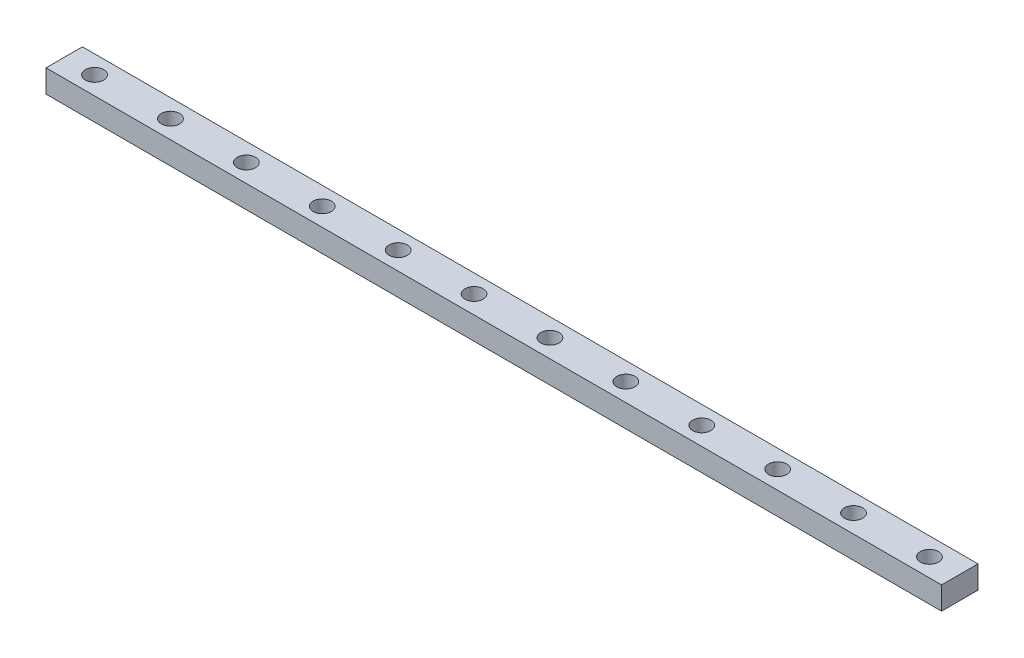
ISO-10303-21;
HEADER;
FILE_DESCRIPTION(('STEP AP214'),'2;1');
FILE_NAME('part.step','',(''),(''),'','','');
FILE_SCHEMA(('AUTOMOTIVE_DESIGN { 1 0 10303 214 1 1 1 1 }'));
ENDSEC;
DATA;
#1=APPLICATION_CONTEXT('core data for automotive mechanical design processes');
#2=APPLICATION_PROTOCOL_DEFINITION('international standard','automotive_design',2000,#1);
#3=PRODUCT_CONTEXT('',#1,'mechanical');
#4=PRODUCT('Part','Part','',(#3));
#5=PRODUCT_RELATED_PRODUCT_CATEGORY('part','',(#4));
#6=PRODUCT_DEFINITION_FORMATION('','',#4);
#7=PRODUCT_DEFINITION_CONTEXT('part definition',#1,'design');
#8=PRODUCT_DEFINITION('design','',#6,#7);
#9=PRODUCT_DEFINITION_SHAPE('','',#8);
#10=(LENGTH_UNIT() NAMED_UNIT(*) SI_UNIT(.MILLI.,.METRE.));
#11=(NAMED_UNIT(*) PLANE_ANGLE_UNIT() SI_UNIT($,.RADIAN.));
#12=(NAMED_UNIT(*) SI_UNIT($,.STERADIAN.) SOLID_ANGLE_UNIT());
#13=UNCERTAINTY_MEASURE_WITH_UNIT(LENGTH_MEASURE(1.E-05),#10,'distance_accuracy_value','');
#14=(GEOMETRIC_REPRESENTATION_CONTEXT(3) GLOBAL_UNCERTAINTY_ASSIGNED_CONTEXT((#13)) GLOBAL_UNIT_ASSIGNED_CONTEXT((#10,
#11,#12)) REPRESENTATION_CONTEXT('',''));
#15=CARTESIAN_POINT('',(0.,0.,0.));
#16=DIRECTION('',(0.,0.,1.));
#17=DIRECTION('',(1.,0.,0.));
#18=AXIS2_PLACEMENT_3D('',#15,#16,#17);
#19=CARTESIAN_POINT('',(0.,7.5,-6.));
#20=DIRECTION('',(1.,0.,0.));
#21=DIRECTION('',(0.,0.,-1.));
#22=AXIS2_PLACEMENT_3D('',#19,#20,#21);
#23=PLANE('',#22);
#24=DIRECTION('',(0.,0.,1.));
#25=VECTOR('',#24,1.);
#26=CARTESIAN_POINT('',(0.,0.,-6.));
#27=LINE('',#26,#25);
#28=CARTESIAN_POINT('',(0.,0.,-6.));
#29=VERTEX_POINT('',#28);
#30=CARTESIAN_POINT('',(0.,0.,6.));
#31=VERTEX_POINT('',#30);
#32=EDGE_CURVE('E97',#29,#31,#27,.T.);
#33=ORIENTED_EDGE('',*,*,#32,.T.);
#34=DIRECTION('',(0.,-1.,0.));
#35=VECTOR('',#34,1.);
#36=CARTESIAN_POINT('',(0.,7.5,6.));
#37=LINE('',#36,#35);
#38=CARTESIAN_POINT('',(0.,7.5,6.));
#39=VERTEX_POINT('',#38);
#40=EDGE_CURVE('E11',#39,#31,#37,.T.);
#41=ORIENTED_EDGE('',*,*,#40,.F.);
#42=DIRECTION('',(0.,0.,1.));
#43=VECTOR('',#42,1.);
#44=CARTESIAN_POINT('',(0.,7.5,-6.));
#45=LINE('',#44,#43);
#46=CARTESIAN_POINT('',(0.,7.5,-6.));
#47=VERTEX_POINT('',#46);
#48=EDGE_CURVE('E85',#47,#39,#45,.T.);
#49=ORIENTED_EDGE('',*,*,#48,.F.);
#50=DIRECTION('',(0.,-1.,0.));
#51=VECTOR('',#50,1.);
#52=CARTESIAN_POINT('',(0.,7.5,-6.));
#53=LINE('',#52,#51);
#54=EDGE_CURVE('E93',#47,#29,#53,.T.);
#55=ORIENTED_EDGE('',*,*,#54,.T.);
#56=EDGE_LOOP('',(#33,#41,#49,#55));
#57=FACE_BOUND('',#56,.T.);
#58=ADVANCED_FACE('F34',(#57),#23,.F.);
#59=CARTESIAN_POINT('',(0.,7.5,6.));
#60=DIRECTION('',(0.,0.,-1.));
#61=DIRECTION('',(-1.,0.,0.));
#62=AXIS2_PLACEMENT_3D('',#59,#60,#61);
#63=PLANE('',#62);
#64=DIRECTION('',(1.,0.,0.));
#65=VECTOR('',#64,1.);
#66=CARTESIAN_POINT('',(0.,0.,6.));
#67=LINE('',#66,#65);
#68=CARTESIAN_POINT('',(295.,0.,6.));
#69=VERTEX_POINT('',#68);
#70=EDGE_CURVE('E89',#31,#69,#67,.T.);
#71=ORIENTED_EDGE('',*,*,#70,.T.);
#72=DIRECTION('',(0.,-1.,0.));
#73=VECTOR('',#72,1.);
#74=CARTESIAN_POINT('',(295.,7.5,6.));
#75=LINE('',#74,#73);
#76=CARTESIAN_POINT('',(295.,7.5,6.));
#77=VERTEX_POINT('',#76);
#78=EDGE_CURVE('E42',#77,#69,#75,.T.);
#79=ORIENTED_EDGE('',*,*,#78,.F.);
#80=DIRECTION('',(1.,0.,0.));
#81=VECTOR('',#80,1.);
#82=CARTESIAN_POINT('',(0.,7.5,6.));
#83=LINE('',#82,#81);
#84=EDGE_CURVE('E80',#39,#77,#83,.T.);
#85=ORIENTED_EDGE('',*,*,#84,.F.);
#86=ORIENTED_EDGE('',*,*,#40,.T.);
#87=EDGE_LOOP('',(#71,#79,#85,#86));
#88=FACE_BOUND('',#87,.T.);
#89=ADVANCED_FACE('F88',(#88),#63,.F.);
#90=CARTESIAN_POINT('',(295.,7.5,-6.));
#91=DIRECTION('',(-1.,0.,0.));
#92=DIRECTION('',(0.,0.,1.));
#93=AXIS2_PLACEMENT_3D('',#90,#91,#92);
#94=PLANE('',#93);
#95=DIRECTION('',(0.,0.,-1.));
#96=VECTOR('',#95,1.);
#97=CARTESIAN_POINT('',(295.,0.,-6.));
#98=LINE('',#97,#96);
#99=CARTESIAN_POINT('',(295.,0.,-6.));
#100=VERTEX_POINT('',#99);
#101=EDGE_CURVE('E67',#69,#100,#98,.T.);
#102=ORIENTED_EDGE('',*,*,#101,.T.);
#103=DIRECTION('',(0.,-1.,0.));
#104=VECTOR('',#103,1.);
#105=CARTESIAN_POINT('',(295.,7.5,-6.));
#106=LINE('',#105,#104);
#107=CARTESIAN_POINT('',(295.,7.5,-6.));
#108=VERTEX_POINT('',#107);
#109=EDGE_CURVE('E90',#108,#100,#106,.T.);
#110=ORIENTED_EDGE('',*,*,#109,.F.);
#111=DIRECTION('',(0.,0.,-1.));
#112=VECTOR('',#111,1.);
#113=CARTESIAN_POINT('',(295.,7.5,-6.));
#114=LINE('',#113,#112);
#115=EDGE_CURVE('E83',#77,#108,#114,.T.);
#116=ORIENTED_EDGE('',*,*,#115,.F.);
#117=ORIENTED_EDGE('',*,*,#78,.T.);
#118=EDGE_LOOP('',(#102,#110,#116,#117));
#119=FACE_BOUND('',#118,.T.);
#120=ADVANCED_FACE('F91',(#119),#94,.F.);
#121=CARTESIAN_POINT('',(0.,7.5,-6.));
#122=DIRECTION('',(0.,0.,1.));
#123=DIRECTION('',(1.,0.,0.));
#124=AXIS2_PLACEMENT_3D('',#121,#122,#123);
#125=PLANE('',#124);
#126=DIRECTION('',(-1.,0.,0.));
#127=VECTOR('',#126,1.);
#128=CARTESIAN_POINT('',(0.,0.,-6.));
#129=LINE('',#128,#127);
#130=EDGE_CURVE('E73',#100,#29,#129,.T.);
#131=ORIENTED_EDGE('',*,*,#130,.T.);
#132=ORIENTED_EDGE('',*,*,#54,.F.);
#133=DIRECTION('',(-1.,0.,0.));
#134=VECTOR('',#133,1.);
#135=CARTESIAN_POINT('',(0.,7.5,-6.));
#136=LINE('',#135,#134);
#137=EDGE_CURVE('E50',#108,#47,#136,.T.);
#138=ORIENTED_EDGE('',*,*,#137,.F.);
#139=ORIENTED_EDGE('',*,*,#109,.T.);
#140=EDGE_LOOP('',(#131,#132,#138,#139));
#141=FACE_BOUND('',#140,.T.);
#142=ADVANCED_FACE('F105',(#141),#125,.F.);
#143=CARTESIAN_POINT('',(0.,7.5,6.));
#144=DIRECTION('',(0.,1.,0.));
#145=DIRECTION('',(0.,0.,1.));
#146=AXIS2_PLACEMENT_3D('',#143,#144,#145);
#147=PLANE('',#146);
#148=CARTESIAN_POINT('',(285.,7.5,0.));
#149=DIRECTION('',(0.,1.,0.));
#150=DIRECTION('',(0.,0.,1.));
#151=AXIS2_PLACEMENT_3D('',#148,#149,#150);
#152=CIRCLE('',#151,3.);
#153=CARTESIAN_POINT('',(285.,7.5,3.));
#154=VERTEX_POINT('',#153);
#155=EDGE_CURVE('E251',#154,#154,#152,.T.);
#156=ORIENTED_EDGE('',*,*,#155,.F.);
#157=EDGE_LOOP('',(#156));
#158=FACE_BOUND('',#157,.T.);
#159=CARTESIAN_POINT('',(260.,7.5,0.));
#160=DIRECTION('',(0.,1.,0.));
#161=DIRECTION('',(0.,0.,1.));
#162=AXIS2_PLACEMENT_3D('',#159,#160,#161);
#163=CIRCLE('',#162,3.);
#164=CARTESIAN_POINT('',(260.,7.5,3.));
#165=VERTEX_POINT('',#164);
#166=EDGE_CURVE('E239',#165,#165,#163,.T.);
#167=ORIENTED_EDGE('',*,*,#166,.F.);
#168=EDGE_LOOP('',(#167));
#169=FACE_BOUND('',#168,.T.);
#170=CARTESIAN_POINT('',(235.,7.5,0.));
#171=DIRECTION('',(0.,1.,0.));
#172=DIRECTION('',(0.,0.,1.));
#173=AXIS2_PLACEMENT_3D('',#170,#171,#172);
#174=CIRCLE('',#173,3.);
#175=CARTESIAN_POINT('',(235.,7.5,3.));
#176=VERTEX_POINT('',#175);
#177=EDGE_CURVE('E227',#176,#176,#174,.T.);
#178=ORIENTED_EDGE('',*,*,#177,.F.);
#179=EDGE_LOOP('',(#178));
#180=FACE_BOUND('',#179,.T.);
#181=CARTESIAN_POINT('',(210.,7.5,0.));
#182=DIRECTION('',(0.,1.,0.));
#183=DIRECTION('',(0.,0.,1.));
#184=AXIS2_PLACEMENT_3D('',#181,#182,#183);
#185=CIRCLE('',#184,3.);
#186=CARTESIAN_POINT('',(210.,7.5,3.));
#187=VERTEX_POINT('',#186);
#188=EDGE_CURVE('E215',#187,#187,#185,.T.);
#189=ORIENTED_EDGE('',*,*,#188,.F.);
#190=EDGE_LOOP('',(#189));
#191=FACE_BOUND('',#190,.T.);
#192=CARTESIAN_POINT('',(185.,7.5,0.));
#193=DIRECTION('',(0.,1.,0.));
#194=DIRECTION('',(0.,0.,1.));
#195=AXIS2_PLACEMENT_3D('',#192,#193,#194);
#196=CIRCLE('',#195,3.);
#197=CARTESIAN_POINT('',(185.,7.5,3.));
#198=VERTEX_POINT('',#197);
#199=EDGE_CURVE('E203',#198,#198,#196,.T.);
#200=ORIENTED_EDGE('',*,*,#199,.F.);
#201=EDGE_LOOP('',(#200));
#202=FACE_BOUND('',#201,.T.);
#203=CARTESIAN_POINT('',(160.,7.5,0.));
#204=DIRECTION('',(0.,1.,0.));
#205=DIRECTION('',(0.,0.,1.));
#206=AXIS2_PLACEMENT_3D('',#203,#204,#205);
#207=CIRCLE('',#206,3.);
#208=CARTESIAN_POINT('',(160.,7.5,3.));
#209=VERTEX_POINT('',#208);
#210=EDGE_CURVE('E191',#209,#209,#207,.T.);
#211=ORIENTED_EDGE('',*,*,#210,.F.);
#212=EDGE_LOOP('',(#211));
#213=FACE_BOUND('',#212,.T.);
#214=CARTESIAN_POINT('',(135.,7.5,0.));
#215=DIRECTION('',(0.,1.,0.));
#216=DIRECTION('',(0.,0.,1.));
#217=AXIS2_PLACEMENT_3D('',#214,#215,#216);
#218=CIRCLE('',#217,3.);
#219=CARTESIAN_POINT('',(135.,7.5,3.));
#220=VERTEX_POINT('',#219);
#221=EDGE_CURVE('E179',#220,#220,#218,.T.);
#222=ORIENTED_EDGE('',*,*,#221,.F.);
#223=EDGE_LOOP('',(#222));
#224=FACE_BOUND('',#223,.T.);
#225=CARTESIAN_POINT('',(110.,7.5,0.));
#226=DIRECTION('',(0.,1.,0.));
#227=DIRECTION('',(0.,0.,1.));
#228=AXIS2_PLACEMENT_3D('',#225,#226,#227);
#229=CIRCLE('',#228,3.);
#230=CARTESIAN_POINT('',(110.,7.5,3.));
#231=VERTEX_POINT('',#230);
#232=EDGE_CURVE('E167',#231,#231,#229,.T.);
#233=ORIENTED_EDGE('',*,*,#232,.F.);
#234=EDGE_LOOP('',(#233));
#235=FACE_BOUND('',#234,.T.);
#236=CARTESIAN_POINT('',(85.,7.5,0.));
#237=DIRECTION('',(0.,1.,0.));
#238=DIRECTION('',(0.,0.,1.));
#239=AXIS2_PLACEMENT_3D('',#236,#237,#238);
#240=CIRCLE('',#239,3.);
#241=CARTESIAN_POINT('',(85.,7.5,3.));
#242=VERTEX_POINT('',#241);
#243=EDGE_CURVE('E155',#242,#242,#240,.T.);
#244=ORIENTED_EDGE('',*,*,#243,.F.);
#245=EDGE_LOOP('',(#244));
#246=FACE_BOUND('',#245,.T.);
#247=CARTESIAN_POINT('',(60.,7.5,0.));
#248=DIRECTION('',(0.,1.,0.));
#249=DIRECTION('',(0.,0.,1.));
#250=AXIS2_PLACEMENT_3D('',#247,#248,#249);
#251=CIRCLE('',#250,3.);
#252=CARTESIAN_POINT('',(60.,7.5,3.));
#253=VERTEX_POINT('',#252);
#254=EDGE_CURVE('E143',#253,#253,#251,.T.);
#255=ORIENTED_EDGE('',*,*,#254,.F.);
#256=EDGE_LOOP('',(#255));
#257=FACE_BOUND('',#256,.T.);
#258=CARTESIAN_POINT('',(35.,7.5,0.));
#259=DIRECTION('',(0.,1.,0.));
#260=DIRECTION('',(0.,0.,1.));
#261=AXIS2_PLACEMENT_3D('',#258,#259,#260);
#262=CIRCLE('',#261,3.);
#263=CARTESIAN_POINT('',(35.,7.5,3.));
#264=VERTEX_POINT('',#263);
#265=EDGE_CURVE('E131',#264,#264,#262,.T.);
#266=ORIENTED_EDGE('',*,*,#265,.F.);
#267=EDGE_LOOP('',(#266));
#268=FACE_BOUND('',#267,.T.);
#269=CARTESIAN_POINT('',(10.,7.5,0.));
#270=DIRECTION('',(0.,1.,0.));
#271=DIRECTION('',(0.,0.,1.));
#272=AXIS2_PLACEMENT_3D('',#269,#270,#271);
#273=CIRCLE('',#272,3.);
#274=CARTESIAN_POINT('',(10.,7.5,3.));
#275=VERTEX_POINT('',#274);
#276=EDGE_CURVE('E119',#275,#275,#273,.T.);
#277=ORIENTED_EDGE('',*,*,#276,.F.);
#278=EDGE_LOOP('',(#277));
#279=FACE_BOUND('',#278,.T.);
#280=ORIENTED_EDGE('',*,*,#48,.T.);
#281=ORIENTED_EDGE('',*,*,#84,.T.);
#282=ORIENTED_EDGE('',*,*,#115,.T.);
#283=ORIENTED_EDGE('',*,*,#137,.T.);
#284=EDGE_LOOP('',(#280,#281,#282,#283));
#285=FACE_BOUND('',#284,.T.);
#286=ADVANCED_FACE('F81',(#158,#169,#180,#191,#202,#213,#224,#235,#246,#257,#268,#279,#285),
#147,.T.);
#287=CARTESIAN_POINT('',(0.,0.,6.));
#288=DIRECTION('',(0.,1.,0.));
#289=DIRECTION('',(0.,0.,1.));
#290=AXIS2_PLACEMENT_3D('',#287,#288,#289);
#291=PLANE('',#290);
#292=CARTESIAN_POINT('',(285.,0.,0.));
#293=DIRECTION('',(0.,1.,0.));
#294=DIRECTION('',(0.,0.,1.));
#295=AXIS2_PLACEMENT_3D('',#292,#293,#294);
#296=CIRCLE('',#295,1.74999999999997);
#297=CARTESIAN_POINT('',(285.,0.,1.74999999999997));
#298=VERTEX_POINT('',#297);
#299=EDGE_CURVE('E242',#298,#298,#296,.T.);
#300=ORIENTED_EDGE('',*,*,#299,.T.);
#301=EDGE_LOOP('',(#300));
#302=FACE_BOUND('',#301,.T.);
#303=CARTESIAN_POINT('',(260.,0.,0.));
#304=DIRECTION('',(0.,1.,0.));
#305=DIRECTION('',(0.,0.,1.));
#306=AXIS2_PLACEMENT_3D('',#303,#304,#305);
#307=CIRCLE('',#306,1.74999999999997);
#308=CARTESIAN_POINT('',(260.,0.,1.74999999999997));
#309=VERTEX_POINT('',#308);
#310=EDGE_CURVE('E230',#309,#309,#307,.T.);
#311=ORIENTED_EDGE('',*,*,#310,.T.);
#312=EDGE_LOOP('',(#311));
#313=FACE_BOUND('',#312,.T.);
#314=CARTESIAN_POINT('',(235.,0.,0.));
#315=DIRECTION('',(0.,1.,0.));
#316=DIRECTION('',(0.,0.,1.));
#317=AXIS2_PLACEMENT_3D('',#314,#315,#316);
#318=CIRCLE('',#317,1.75);
#319=CARTESIAN_POINT('',(235.,0.,1.75));
#320=VERTEX_POINT('',#319);
#321=EDGE_CURVE('E218',#320,#320,#318,.T.);
#322=ORIENTED_EDGE('',*,*,#321,.T.);
#323=EDGE_LOOP('',(#322));
#324=FACE_BOUND('',#323,.T.);
#325=CARTESIAN_POINT('',(210.,0.,0.));
#326=DIRECTION('',(0.,1.,0.));
#327=DIRECTION('',(0.,0.,1.));
#328=AXIS2_PLACEMENT_3D('',#325,#326,#327);
#329=CIRCLE('',#328,1.75);
#330=CARTESIAN_POINT('',(210.,0.,1.75));
#331=VERTEX_POINT('',#330);
#332=EDGE_CURVE('E206',#331,#331,#329,.T.);
#333=ORIENTED_EDGE('',*,*,#332,.T.);
#334=EDGE_LOOP('',(#333));
#335=FACE_BOUND('',#334,.T.);
#336=CARTESIAN_POINT('',(185.,0.,0.));
#337=DIRECTION('',(0.,1.,0.));
#338=DIRECTION('',(0.,0.,1.));
#339=AXIS2_PLACEMENT_3D('',#336,#337,#338);
#340=CIRCLE('',#339,1.75);
#341=CARTESIAN_POINT('',(185.,0.,1.75));
#342=VERTEX_POINT('',#341);
#343=EDGE_CURVE('E194',#342,#342,#340,.T.);
#344=ORIENTED_EDGE('',*,*,#343,.T.);
#345=EDGE_LOOP('',(#344));
#346=FACE_BOUND('',#345,.T.);
#347=CARTESIAN_POINT('',(160.,0.,0.));
#348=DIRECTION('',(0.,1.,0.));
#349=DIRECTION('',(0.,0.,1.));
#350=AXIS2_PLACEMENT_3D('',#347,#348,#349);
#351=CIRCLE('',#350,1.75);
#352=CARTESIAN_POINT('',(160.,0.,1.75));
#353=VERTEX_POINT('',#352);
#354=EDGE_CURVE('E182',#353,#353,#351,.T.);
#355=ORIENTED_EDGE('',*,*,#354,.T.);
#356=EDGE_LOOP('',(#355));
#357=FACE_BOUND('',#356,.T.);
#358=CARTESIAN_POINT('',(135.,0.,0.));
#359=DIRECTION('',(0.,1.,0.));
#360=DIRECTION('',(0.,0.,1.));
#361=AXIS2_PLACEMENT_3D('',#358,#359,#360);
#362=CIRCLE('',#361,1.75);
#363=CARTESIAN_POINT('',(135.,0.,1.75));
#364=VERTEX_POINT('',#363);
#365=EDGE_CURVE('E170',#364,#364,#362,.T.);
#366=ORIENTED_EDGE('',*,*,#365,.T.);
#367=EDGE_LOOP('',(#366));
#368=FACE_BOUND('',#367,.T.);
#369=CARTESIAN_POINT('',(110.,0.,0.));
#370=DIRECTION('',(0.,1.,0.));
#371=DIRECTION('',(0.,0.,1.));
#372=AXIS2_PLACEMENT_3D('',#369,#370,#371);
#373=CIRCLE('',#372,1.75);
#374=CARTESIAN_POINT('',(110.,0.,1.75));
#375=VERTEX_POINT('',#374);
#376=EDGE_CURVE('E158',#375,#375,#373,.T.);
#377=ORIENTED_EDGE('',*,*,#376,.T.);
#378=EDGE_LOOP('',(#377));
#379=FACE_BOUND('',#378,.T.);
#380=CARTESIAN_POINT('',(85.,0.,0.));
#381=DIRECTION('',(0.,1.,0.));
#382=DIRECTION('',(0.,0.,1.));
#383=AXIS2_PLACEMENT_3D('',#380,#381,#382);
#384=CIRCLE('',#383,1.75);
#385=CARTESIAN_POINT('',(85.,0.,1.75));
#386=VERTEX_POINT('',#385);
#387=EDGE_CURVE('E146',#386,#386,#384,.T.);
#388=ORIENTED_EDGE('',*,*,#387,.T.);
#389=EDGE_LOOP('',(#388));
#390=FACE_BOUND('',#389,.T.);
#391=CARTESIAN_POINT('',(60.,0.,0.));
#392=DIRECTION('',(0.,1.,0.));
#393=DIRECTION('',(0.,0.,1.));
#394=AXIS2_PLACEMENT_3D('',#391,#392,#393);
#395=CIRCLE('',#394,1.75);
#396=CARTESIAN_POINT('',(60.,0.,1.75));
#397=VERTEX_POINT('',#396);
#398=EDGE_CURVE('E134',#397,#397,#395,.T.);
#399=ORIENTED_EDGE('',*,*,#398,.T.);
#400=EDGE_LOOP('',(#399));
#401=FACE_BOUND('',#400,.T.);
#402=CARTESIAN_POINT('',(35.,0.,0.));
#403=DIRECTION('',(0.,1.,0.));
#404=DIRECTION('',(0.,0.,1.));
#405=AXIS2_PLACEMENT_3D('',#402,#403,#404);
#406=CIRCLE('',#405,1.75);
#407=CARTESIAN_POINT('',(35.,0.,1.75));
#408=VERTEX_POINT('',#407);
#409=EDGE_CURVE('E122',#408,#408,#406,.T.);
#410=ORIENTED_EDGE('',*,*,#409,.T.);
#411=EDGE_LOOP('',(#410));
#412=FACE_BOUND('',#411,.T.);
#413=CARTESIAN_POINT('',(10.,0.,0.));
#414=DIRECTION('',(0.,1.,0.));
#415=DIRECTION('',(0.,0.,1.));
#416=AXIS2_PLACEMENT_3D('',#413,#414,#415);
#417=CIRCLE('',#416,1.75);
#418=CARTESIAN_POINT('',(10.,0.,1.75));
#419=VERTEX_POINT('',#418);
#420=EDGE_CURVE('E100',#419,#419,#417,.T.);
#421=ORIENTED_EDGE('',*,*,#420,.T.);
#422=EDGE_LOOP('',(#421));
#423=FACE_BOUND('',#422,.T.);
#424=ORIENTED_EDGE('',*,*,#32,.F.);
#425=ORIENTED_EDGE('',*,*,#130,.F.);
#426=ORIENTED_EDGE('',*,*,#101,.F.);
#427=ORIENTED_EDGE('',*,*,#70,.F.);
#428=EDGE_LOOP('',(#424,#425,#426,#427));
#429=FACE_BOUND('',#428,.T.);
#430=ADVANCED_FACE('F108',(#302,#313,#324,#335,#346,#357,#368,#379,#390,#401,#412,#423,#429),
#291,.F.);
#431=CARTESIAN_POINT('',(10.,7.5,0.));
#432=DIRECTION('',(0.,1.,0.));
#433=DIRECTION('',(0.,0.,1.));
#434=AXIS2_PLACEMENT_3D('',#431,#432,#433);
#435=CYLINDRICAL_SURFACE('',#434,1.75);
#436=ORIENTED_EDGE('',*,*,#420,.F.);
#437=EDGE_LOOP('',(#436));
#438=FACE_BOUND('',#437,.T.);
#439=CARTESIAN_POINT('',(10.,3.,0.));
#440=DIRECTION('',(0.,1.,0.));
#441=DIRECTION('',(0.,0.,1.));
#442=AXIS2_PLACEMENT_3D('',#439,#440,#441);
#443=CIRCLE('',#442,1.75);
#444=CARTESIAN_POINT('',(10.,3.,1.75));
#445=VERTEX_POINT('',#444);
#446=EDGE_CURVE('E113',#445,#445,#443,.T.);
#447=ORIENTED_EDGE('',*,*,#446,.T.);
#448=EDGE_LOOP('',(#447));
#449=FACE_BOUND('',#448,.T.);
#450=ADVANCED_FACE('F295',(#438,#449),#435,.F.);
#451=CARTESIAN_POINT('',(11.75,3.,0.));
#452=DIRECTION('',(0.,-1.,0.));
#453=DIRECTION('',(0.,0.,-1.));
#454=AXIS2_PLACEMENT_3D('',#451,#452,#453);
#455=PLANE('',#454);
#456=ORIENTED_EDGE('',*,*,#446,.F.);
#457=EDGE_LOOP('',(#456));
#458=FACE_BOUND('',#457,.T.);
#459=CARTESIAN_POINT('',(10.,3.,0.));
#460=DIRECTION('',(0.,1.,0.));
#461=DIRECTION('',(0.,0.,1.));
#462=AXIS2_PLACEMENT_3D('',#459,#460,#461);
#463=CIRCLE('',#462,3.);
#464=CARTESIAN_POINT('',(10.,3.,3.));
#465=VERTEX_POINT('',#464);
#466=EDGE_CURVE('E116',#465,#465,#463,.T.);
#467=ORIENTED_EDGE('',*,*,#466,.T.);
#468=EDGE_LOOP('',(#467));
#469=FACE_BOUND('',#468,.T.);
#470=ADVANCED_FACE('F285',(#458,#469),#455,.F.);
#471=CARTESIAN_POINT('',(10.,7.5,0.));
#472=DIRECTION('',(0.,1.,0.));
#473=DIRECTION('',(0.,0.,1.));
#474=AXIS2_PLACEMENT_3D('',#471,#472,#473);
#475=CYLINDRICAL_SURFACE('',#474,3.);
#476=ORIENTED_EDGE('',*,*,#466,.F.);
#477=EDGE_LOOP('',(#476));
#478=FACE_BOUND('',#477,.T.);
#479=ORIENTED_EDGE('',*,*,#276,.T.);
#480=EDGE_LOOP('',(#479));
#481=FACE_BOUND('',#480,.T.);
#482=ADVANCED_FACE('F282',(#478,#481),#475,.F.);
#483=CARTESIAN_POINT('',(35.,7.5,0.));
#484=DIRECTION('',(0.,1.,0.));
#485=DIRECTION('',(0.,0.,1.));
#486=AXIS2_PLACEMENT_3D('',#483,#484,#485);
#487=CYLINDRICAL_SURFACE('',#486,1.75);
#488=ORIENTED_EDGE('',*,*,#409,.F.);
#489=EDGE_LOOP('',(#488));
#490=FACE_BOUND('',#489,.T.);
#491=CARTESIAN_POINT('',(35.,3.,0.));
#492=DIRECTION('',(0.,1.,0.));
#493=DIRECTION('',(0.,0.,1.));
#494=AXIS2_PLACEMENT_3D('',#491,#492,#493);
#495=CIRCLE('',#494,1.75);
#496=CARTESIAN_POINT('',(35.,3.,1.75));
#497=VERTEX_POINT('',#496);
#498=EDGE_CURVE('E125',#497,#497,#495,.T.);
#499=ORIENTED_EDGE('',*,*,#498,.T.);
#500=EDGE_LOOP('',(#499));
#501=FACE_BOUND('',#500,.T.);
#502=ADVANCED_FACE('F284',(#490,#501),#487,.F.);
#503=CARTESIAN_POINT('',(36.75,3.,0.));
#504=DIRECTION('',(0.,-1.,0.));
#505=DIRECTION('',(0.,0.,-1.));
#506=AXIS2_PLACEMENT_3D('',#503,#504,#505);
#507=PLANE('',#506);
#508=ORIENTED_EDGE('',*,*,#498,.F.);
#509=EDGE_LOOP('',(#508));
#510=FACE_BOUND('',#509,.T.);
#511=CARTESIAN_POINT('',(35.,3.,0.));
#512=DIRECTION('',(0.,1.,0.));
#513=DIRECTION('',(0.,0.,1.));
#514=AXIS2_PLACEMENT_3D('',#511,#512,#513);
#515=CIRCLE('',#514,3.);
#516=CARTESIAN_POINT('',(35.,3.,3.));
#517=VERTEX_POINT('',#516);
#518=EDGE_CURVE('E128',#517,#517,#515,.T.);
#519=ORIENTED_EDGE('',*,*,#518,.T.);
#520=EDGE_LOOP('',(#519));
#521=FACE_BOUND('',#520,.T.);
#522=ADVANCED_FACE('F292',(#510,#521),#507,.F.);
#523=CARTESIAN_POINT('',(35.,7.5,0.));
#524=DIRECTION('',(0.,1.,0.));
#525=DIRECTION('',(0.,0.,1.));
#526=AXIS2_PLACEMENT_3D('',#523,#524,#525);
#527=CYLINDRICAL_SURFACE('',#526,3.);
#528=ORIENTED_EDGE('',*,*,#518,.F.);
#529=EDGE_LOOP('',(#528));
#530=FACE_BOUND('',#529,.T.);
#531=ORIENTED_EDGE('',*,*,#265,.T.);
#532=EDGE_LOOP('',(#531));
#533=FACE_BOUND('',#532,.T.);
#534=ADVANCED_FACE('F359',(#530,#533),#527,.F.);
#535=CARTESIAN_POINT('',(60.,7.5,0.));
#536=DIRECTION('',(0.,1.,0.));
#537=DIRECTION('',(0.,0.,1.));
#538=AXIS2_PLACEMENT_3D('',#535,#536,#537);
#539=CYLINDRICAL_SURFACE('',#538,1.75);
#540=ORIENTED_EDGE('',*,*,#398,.F.);
#541=EDGE_LOOP('',(#540));
#542=FACE_BOUND('',#541,.T.);
#543=CARTESIAN_POINT('',(60.,3.,0.));
#544=DIRECTION('',(0.,1.,0.));
#545=DIRECTION('',(0.,0.,1.));
#546=AXIS2_PLACEMENT_3D('',#543,#544,#545);
#547=CIRCLE('',#546,1.75);
#548=CARTESIAN_POINT('',(60.,3.,1.75));
#549=VERTEX_POINT('',#548);
#550=EDGE_CURVE('E137',#549,#549,#547,.T.);
#551=ORIENTED_EDGE('',*,*,#550,.T.);
#552=EDGE_LOOP('',(#551));
#553=FACE_BOUND('',#552,.T.);
#554=ADVANCED_FACE('F369',(#542,#553),#539,.F.);
#555=CARTESIAN_POINT('',(61.75,3.,0.));
#556=DIRECTION('',(0.,-1.,0.));
#557=DIRECTION('',(0.,0.,-1.));
#558=AXIS2_PLACEMENT_3D('',#555,#556,#557);
#559=PLANE('',#558);
#560=ORIENTED_EDGE('',*,*,#550,.F.);
#561=EDGE_LOOP('',(#560));
#562=FACE_BOUND('',#561,.T.);
#563=CARTESIAN_POINT('',(60.,3.,0.));
#564=DIRECTION('',(0.,1.,0.));
#565=DIRECTION('',(0.,0.,1.));
#566=AXIS2_PLACEMENT_3D('',#563,#564,#565);
#567=CIRCLE('',#566,3.);
#568=CARTESIAN_POINT('',(60.,3.,3.));
#569=VERTEX_POINT('',#568);
#570=EDGE_CURVE('E140',#569,#569,#567,.T.);
#571=ORIENTED_EDGE('',*,*,#570,.T.);
#572=EDGE_LOOP('',(#571));
#573=FACE_BOUND('',#572,.T.);
#574=ADVANCED_FACE('F379',(#562,#573),#559,.F.);
#575=CARTESIAN_POINT('',(60.,7.5,0.));
#576=DIRECTION('',(0.,1.,0.));
#577=DIRECTION('',(0.,0.,1.));
#578=AXIS2_PLACEMENT_3D('',#575,#576,#577);
#579=CYLINDRICAL_SURFACE('',#578,3.);
#580=ORIENTED_EDGE('',*,*,#570,.F.);
#581=EDGE_LOOP('',(#580));
#582=FACE_BOUND('',#581,.T.);
#583=ORIENTED_EDGE('',*,*,#254,.T.);
#584=EDGE_LOOP('',(#583));
#585=FACE_BOUND('',#584,.T.);
#586=ADVANCED_FACE('F389',(#582,#585),#579,.F.);
#587=CARTESIAN_POINT('',(85.,7.5,0.));
#588=DIRECTION('',(0.,1.,0.));
#589=DIRECTION('',(0.,0.,1.));
#590=AXIS2_PLACEMENT_3D('',#587,#588,#589);
#591=CYLINDRICAL_SURFACE('',#590,1.75);
#592=ORIENTED_EDGE('',*,*,#387,.F.);
#593=EDGE_LOOP('',(#592));
#594=FACE_BOUND('',#593,.T.);
#595=CARTESIAN_POINT('',(85.,3.,0.));
#596=DIRECTION('',(0.,1.,0.));
#597=DIRECTION('',(0.,0.,1.));
#598=AXIS2_PLACEMENT_3D('',#595,#596,#597);
#599=CIRCLE('',#598,1.75);
#600=CARTESIAN_POINT('',(85.,3.,1.75));
#601=VERTEX_POINT('',#600);
#602=EDGE_CURVE('E149',#601,#601,#599,.T.);
#603=ORIENTED_EDGE('',*,*,#602,.T.);
#604=EDGE_LOOP('',(#603));
#605=FACE_BOUND('',#604,.T.);
#606=ADVANCED_FACE('F399',(#594,#605),#591,.F.);
#607=CARTESIAN_POINT('',(86.75,3.,0.));
#608=DIRECTION('',(0.,-1.,0.));
#609=DIRECTION('',(0.,0.,-1.));
#610=AXIS2_PLACEMENT_3D('',#607,#608,#609);
#611=PLANE('',#610);
#612=ORIENTED_EDGE('',*,*,#602,.F.);
#613=EDGE_LOOP('',(#612));
#614=FACE_BOUND('',#613,.T.);
#615=CARTESIAN_POINT('',(85.,3.,0.));
#616=DIRECTION('',(0.,1.,0.));
#617=DIRECTION('',(0.,0.,1.));
#618=AXIS2_PLACEMENT_3D('',#615,#616,#617);
#619=CIRCLE('',#618,3.);
#620=CARTESIAN_POINT('',(85.,3.,3.));
#621=VERTEX_POINT('',#620);
#622=EDGE_CURVE('E152',#621,#621,#619,.T.);
#623=ORIENTED_EDGE('',*,*,#622,.T.);
#624=EDGE_LOOP('',(#623));
#625=FACE_BOUND('',#624,.T.);
#626=ADVANCED_FACE('F409',(#614,#625),#611,.F.);
#627=CARTESIAN_POINT('',(85.,7.5,0.));
#628=DIRECTION('',(0.,1.,0.));
#629=DIRECTION('',(0.,0.,1.));
#630=AXIS2_PLACEMENT_3D('',#627,#628,#629);
#631=CYLINDRICAL_SURFACE('',#630,3.);
#632=ORIENTED_EDGE('',*,*,#622,.F.);
#633=EDGE_LOOP('',(#632));
#634=FACE_BOUND('',#633,.T.);
#635=ORIENTED_EDGE('',*,*,#243,.T.);
#636=EDGE_LOOP('',(#635));
#637=FACE_BOUND('',#636,.T.);
#638=ADVANCED_FACE('F419',(#634,#637),#631,.F.);
#639=CARTESIAN_POINT('',(110.,7.5,0.));
#640=DIRECTION('',(0.,1.,0.));
#641=DIRECTION('',(0.,0.,1.));
#642=AXIS2_PLACEMENT_3D('',#639,#640,#641);
#643=CYLINDRICAL_SURFACE('',#642,1.75);
#644=ORIENTED_EDGE('',*,*,#376,.F.);
#645=EDGE_LOOP('',(#644));
#646=FACE_BOUND('',#645,.T.);
#647=CARTESIAN_POINT('',(110.,3.,0.));
#648=DIRECTION('',(0.,1.,0.));
#649=DIRECTION('',(0.,0.,1.));
#650=AXIS2_PLACEMENT_3D('',#647,#648,#649);
#651=CIRCLE('',#650,1.75);
#652=CARTESIAN_POINT('',(110.,3.,1.75));
#653=VERTEX_POINT('',#652);
#654=EDGE_CURVE('E161',#653,#653,#651,.T.);
#655=ORIENTED_EDGE('',*,*,#654,.T.);
#656=EDGE_LOOP('',(#655));
#657=FACE_BOUND('',#656,.T.);
#658=ADVANCED_FACE('F429',(#646,#657),#643,.F.);
#659=CARTESIAN_POINT('',(111.75,3.,0.));
#660=DIRECTION('',(0.,-1.,0.));
#661=DIRECTION('',(0.,0.,-1.));
#662=AXIS2_PLACEMENT_3D('',#659,#660,#661);
#663=PLANE('',#662);
#664=ORIENTED_EDGE('',*,*,#654,.F.);
#665=EDGE_LOOP('',(#664));
#666=FACE_BOUND('',#665,.T.);
#667=CARTESIAN_POINT('',(110.,3.,0.));
#668=DIRECTION('',(0.,1.,0.));
#669=DIRECTION('',(0.,0.,1.));
#670=AXIS2_PLACEMENT_3D('',#667,#668,#669);
#671=CIRCLE('',#670,3.);
#672=CARTESIAN_POINT('',(110.,3.,3.));
#673=VERTEX_POINT('',#672);
#674=EDGE_CURVE('E164',#673,#673,#671,.T.);
#675=ORIENTED_EDGE('',*,*,#674,.T.);
#676=EDGE_LOOP('',(#675));
#677=FACE_BOUND('',#676,.T.);
#678=ADVANCED_FACE('F439',(#666,#677),#663,.F.);
#679=CARTESIAN_POINT('',(110.,7.5,0.));
#680=DIRECTION('',(0.,1.,0.));
#681=DIRECTION('',(0.,0.,1.));
#682=AXIS2_PLACEMENT_3D('',#679,#680,#681);
#683=CYLINDRICAL_SURFACE('',#682,3.);
#684=ORIENTED_EDGE('',*,*,#674,.F.);
#685=EDGE_LOOP('',(#684));
#686=FACE_BOUND('',#685,.T.);
#687=ORIENTED_EDGE('',*,*,#232,.T.);
#688=EDGE_LOOP('',(#687));
#689=FACE_BOUND('',#688,.T.);
#690=ADVANCED_FACE('F449',(#686,#689),#683,.F.);
#691=CARTESIAN_POINT('',(135.,7.5,0.));
#692=DIRECTION('',(0.,1.,0.));
#693=DIRECTION('',(0.,0.,1.));
#694=AXIS2_PLACEMENT_3D('',#691,#692,#693);
#695=CYLINDRICAL_SURFACE('',#694,1.75);
#696=ORIENTED_EDGE('',*,*,#365,.F.);
#697=EDGE_LOOP('',(#696));
#698=FACE_BOUND('',#697,.T.);
#699=CARTESIAN_POINT('',(135.,3.,0.));
#700=DIRECTION('',(0.,1.,0.));
#701=DIRECTION('',(0.,0.,1.));
#702=AXIS2_PLACEMENT_3D('',#699,#700,#701);
#703=CIRCLE('',#702,1.75);
#704=CARTESIAN_POINT('',(135.,3.,1.75));
#705=VERTEX_POINT('',#704);
#706=EDGE_CURVE('E173',#705,#705,#703,.T.);
#707=ORIENTED_EDGE('',*,*,#706,.T.);
#708=EDGE_LOOP('',(#707));
#709=FACE_BOUND('',#708,.T.);
#710=ADVANCED_FACE('F459',(#698,#709),#695,.F.);
#711=CARTESIAN_POINT('',(136.75,3.,0.));
#712=DIRECTION('',(0.,-1.,0.));
#713=DIRECTION('',(0.,0.,-1.));
#714=AXIS2_PLACEMENT_3D('',#711,#712,#713);
#715=PLANE('',#714);
#716=ORIENTED_EDGE('',*,*,#706,.F.);
#717=EDGE_LOOP('',(#716));
#718=FACE_BOUND('',#717,.T.);
#719=CARTESIAN_POINT('',(135.,3.,0.));
#720=DIRECTION('',(0.,1.,0.));
#721=DIRECTION('',(0.,0.,1.));
#722=AXIS2_PLACEMENT_3D('',#719,#720,#721);
#723=CIRCLE('',#722,3.);
#724=CARTESIAN_POINT('',(135.,3.,3.));
#725=VERTEX_POINT('',#724);
#726=EDGE_CURVE('E176',#725,#725,#723,.T.);
#727=ORIENTED_EDGE('',*,*,#726,.T.);
#728=EDGE_LOOP('',(#727));
#729=FACE_BOUND('',#728,.T.);
#730=ADVANCED_FACE('F469',(#718,#729),#715,.F.);
#731=CARTESIAN_POINT('',(135.,7.5,0.));
#732=DIRECTION('',(0.,1.,0.));
#733=DIRECTION('',(0.,0.,1.));
#734=AXIS2_PLACEMENT_3D('',#731,#732,#733);
#735=CYLINDRICAL_SURFACE('',#734,3.);
#736=ORIENTED_EDGE('',*,*,#726,.F.);
#737=EDGE_LOOP('',(#736));
#738=FACE_BOUND('',#737,.T.);
#739=ORIENTED_EDGE('',*,*,#221,.T.);
#740=EDGE_LOOP('',(#739));
#741=FACE_BOUND('',#740,.T.);
#742=ADVANCED_FACE('F479',(#738,#741),#735,.F.);
#743=CARTESIAN_POINT('',(160.,7.5,0.));
#744=DIRECTION('',(0.,1.,0.));
#745=DIRECTION('',(0.,0.,1.));
#746=AXIS2_PLACEMENT_3D('',#743,#744,#745);
#747=CYLINDRICAL_SURFACE('',#746,1.75);
#748=ORIENTED_EDGE('',*,*,#354,.F.);
#749=EDGE_LOOP('',(#748));
#750=FACE_BOUND('',#749,.T.);
#751=CARTESIAN_POINT('',(160.,3.,0.));
#752=DIRECTION('',(0.,1.,0.));
#753=DIRECTION('',(0.,0.,1.));
#754=AXIS2_PLACEMENT_3D('',#751,#752,#753);
#755=CIRCLE('',#754,1.75);
#756=CARTESIAN_POINT('',(160.,3.,1.75));
#757=VERTEX_POINT('',#756);
#758=EDGE_CURVE('E185',#757,#757,#755,.T.);
#759=ORIENTED_EDGE('',*,*,#758,.T.);
#760=EDGE_LOOP('',(#759));
#761=FACE_BOUND('',#760,.T.);
#762=ADVANCED_FACE('F489',(#750,#761),#747,.F.);
#763=CARTESIAN_POINT('',(161.75,3.,0.));
#764=DIRECTION('',(0.,-1.,0.));
#765=DIRECTION('',(0.,0.,-1.));
#766=AXIS2_PLACEMENT_3D('',#763,#764,#765);
#767=PLANE('',#766);
#768=ORIENTED_EDGE('',*,*,#758,.F.);
#769=EDGE_LOOP('',(#768));
#770=FACE_BOUND('',#769,.T.);
#771=CARTESIAN_POINT('',(160.,3.,0.));
#772=DIRECTION('',(0.,1.,0.));
#773=DIRECTION('',(0.,0.,1.));
#774=AXIS2_PLACEMENT_3D('',#771,#772,#773);
#775=CIRCLE('',#774,3.);
#776=CARTESIAN_POINT('',(160.,3.,3.));
#777=VERTEX_POINT('',#776);
#778=EDGE_CURVE('E188',#777,#777,#775,.T.);
#779=ORIENTED_EDGE('',*,*,#778,.T.);
#780=EDGE_LOOP('',(#779));
#781=FACE_BOUND('',#780,.T.);
#782=ADVANCED_FACE('F499',(#770,#781),#767,.F.);
#783=CARTESIAN_POINT('',(160.,7.5,0.));
#784=DIRECTION('',(0.,1.,0.));
#785=DIRECTION('',(0.,0.,1.));
#786=AXIS2_PLACEMENT_3D('',#783,#784,#785);
#787=CYLINDRICAL_SURFACE('',#786,3.);
#788=ORIENTED_EDGE('',*,*,#778,.F.);
#789=EDGE_LOOP('',(#788));
#790=FACE_BOUND('',#789,.T.);
#791=ORIENTED_EDGE('',*,*,#210,.T.);
#792=EDGE_LOOP('',(#791));
#793=FACE_BOUND('',#792,.T.);
#794=ADVANCED_FACE('F509',(#790,#793),#787,.F.);
#795=CARTESIAN_POINT('',(185.,7.5,0.));
#796=DIRECTION('',(0.,1.,0.));
#797=DIRECTION('',(0.,0.,1.));
#798=AXIS2_PLACEMENT_3D('',#795,#796,#797);
#799=CYLINDRICAL_SURFACE('',#798,1.75);
#800=ORIENTED_EDGE('',*,*,#343,.F.);
#801=EDGE_LOOP('',(#800));
#802=FACE_BOUND('',#801,.T.);
#803=CARTESIAN_POINT('',(185.,3.,0.));
#804=DIRECTION('',(0.,1.,0.));
#805=DIRECTION('',(0.,0.,1.));
#806=AXIS2_PLACEMENT_3D('',#803,#804,#805);
#807=CIRCLE('',#806,1.75);
#808=CARTESIAN_POINT('',(185.,3.,1.75));
#809=VERTEX_POINT('',#808);
#810=EDGE_CURVE('E197',#809,#809,#807,.T.);
#811=ORIENTED_EDGE('',*,*,#810,.T.);
#812=EDGE_LOOP('',(#811));
#813=FACE_BOUND('',#812,.T.);
#814=ADVANCED_FACE('F519',(#802,#813),#799,.F.);
#815=CARTESIAN_POINT('',(186.75,3.,0.));
#816=DIRECTION('',(0.,-1.,0.));
#817=DIRECTION('',(0.,0.,-1.));
#818=AXIS2_PLACEMENT_3D('',#815,#816,#817);
#819=PLANE('',#818);
#820=ORIENTED_EDGE('',*,*,#810,.F.);
#821=EDGE_LOOP('',(#820));
#822=FACE_BOUND('',#821,.T.);
#823=CARTESIAN_POINT('',(185.,3.,0.));
#824=DIRECTION('',(0.,1.,0.));
#825=DIRECTION('',(0.,0.,1.));
#826=AXIS2_PLACEMENT_3D('',#823,#824,#825);
#827=CIRCLE('',#826,3.);
#828=CARTESIAN_POINT('',(185.,3.,3.));
#829=VERTEX_POINT('',#828);
#830=EDGE_CURVE('E200',#829,#829,#827,.T.);
#831=ORIENTED_EDGE('',*,*,#830,.T.);
#832=EDGE_LOOP('',(#831));
#833=FACE_BOUND('',#832,.T.);
#834=ADVANCED_FACE('F529',(#822,#833),#819,.F.);
#835=CARTESIAN_POINT('',(185.,7.5,0.));
#836=DIRECTION('',(0.,1.,0.));
#837=DIRECTION('',(0.,0.,1.));
#838=AXIS2_PLACEMENT_3D('',#835,#836,#837);
#839=CYLINDRICAL_SURFACE('',#838,3.);
#840=ORIENTED_EDGE('',*,*,#830,.F.);
#841=EDGE_LOOP('',(#840));
#842=FACE_BOUND('',#841,.T.);
#843=ORIENTED_EDGE('',*,*,#199,.T.);
#844=EDGE_LOOP('',(#843));
#845=FACE_BOUND('',#844,.T.);
#846=ADVANCED_FACE('F539',(#842,#845),#839,.F.);
#847=CARTESIAN_POINT('',(210.,7.5,0.));
#848=DIRECTION('',(0.,1.,0.));
#849=DIRECTION('',(0.,0.,1.));
#850=AXIS2_PLACEMENT_3D('',#847,#848,#849);
#851=CYLINDRICAL_SURFACE('',#850,1.75);
#852=ORIENTED_EDGE('',*,*,#332,.F.);
#853=EDGE_LOOP('',(#852));
#854=FACE_BOUND('',#853,.T.);
#855=CARTESIAN_POINT('',(210.,3.,0.));
#856=DIRECTION('',(0.,1.,0.));
#857=DIRECTION('',(0.,0.,1.));
#858=AXIS2_PLACEMENT_3D('',#855,#856,#857);
#859=CIRCLE('',#858,1.75);
#860=CARTESIAN_POINT('',(210.,3.,1.75));
#861=VERTEX_POINT('',#860);
#862=EDGE_CURVE('E209',#861,#861,#859,.T.);
#863=ORIENTED_EDGE('',*,*,#862,.T.);
#864=EDGE_LOOP('',(#863));
#865=FACE_BOUND('',#864,.T.);
#866=ADVANCED_FACE('F549',(#854,#865),#851,.F.);
#867=CARTESIAN_POINT('',(211.75,3.,0.));
#868=DIRECTION('',(0.,-1.,0.));
#869=DIRECTION('',(0.,0.,-1.));
#870=AXIS2_PLACEMENT_3D('',#867,#868,#869);
#871=PLANE('',#870);
#872=ORIENTED_EDGE('',*,*,#862,.F.);
#873=EDGE_LOOP('',(#872));
#874=FACE_BOUND('',#873,.T.);
#875=CARTESIAN_POINT('',(210.,3.,0.));
#876=DIRECTION('',(0.,1.,0.));
#877=DIRECTION('',(0.,0.,1.));
#878=AXIS2_PLACEMENT_3D('',#875,#876,#877);
#879=CIRCLE('',#878,3.);
#880=CARTESIAN_POINT('',(210.,3.,3.));
#881=VERTEX_POINT('',#880);
#882=EDGE_CURVE('E212',#881,#881,#879,.T.);
#883=ORIENTED_EDGE('',*,*,#882,.T.);
#884=EDGE_LOOP('',(#883));
#885=FACE_BOUND('',#884,.T.);
#886=ADVANCED_FACE('F559',(#874,#885),#871,.F.);
#887=CARTESIAN_POINT('',(210.,7.5,0.));
#888=DIRECTION('',(0.,1.,0.));
#889=DIRECTION('',(0.,0.,1.));
#890=AXIS2_PLACEMENT_3D('',#887,#888,#889);
#891=CYLINDRICAL_SURFACE('',#890,3.);
#892=ORIENTED_EDGE('',*,*,#882,.F.);
#893=EDGE_LOOP('',(#892));
#894=FACE_BOUND('',#893,.T.);
#895=ORIENTED_EDGE('',*,*,#188,.T.);
#896=EDGE_LOOP('',(#895));
#897=FACE_BOUND('',#896,.T.);
#898=ADVANCED_FACE('F569',(#894,#897),#891,.F.);
#899=CARTESIAN_POINT('',(235.,7.5,0.));
#900=DIRECTION('',(0.,1.,0.));
#901=DIRECTION('',(0.,0.,1.));
#902=AXIS2_PLACEMENT_3D('',#899,#900,#901);
#903=CYLINDRICAL_SURFACE('',#902,1.75);
#904=ORIENTED_EDGE('',*,*,#321,.F.);
#905=EDGE_LOOP('',(#904));
#906=FACE_BOUND('',#905,.T.);
#907=CARTESIAN_POINT('',(235.,3.,0.));
#908=DIRECTION('',(0.,1.,0.));
#909=DIRECTION('',(0.,0.,1.));
#910=AXIS2_PLACEMENT_3D('',#907,#908,#909);
#911=CIRCLE('',#910,1.75);
#912=CARTESIAN_POINT('',(235.,3.,1.75));
#913=VERTEX_POINT('',#912);
#914=EDGE_CURVE('E221',#913,#913,#911,.T.);
#915=ORIENTED_EDGE('',*,*,#914,.T.);
#916=EDGE_LOOP('',(#915));
#917=FACE_BOUND('',#916,.T.);
#918=ADVANCED_FACE('F579',(#906,#917),#903,.F.);
#919=CARTESIAN_POINT('',(236.75,3.,0.));
#920=DIRECTION('',(0.,-1.,0.));
#921=DIRECTION('',(0.,0.,-1.));
#922=AXIS2_PLACEMENT_3D('',#919,#920,#921);
#923=PLANE('',#922);
#924=ORIENTED_EDGE('',*,*,#914,.F.);
#925=EDGE_LOOP('',(#924));
#926=FACE_BOUND('',#925,.T.);
#927=CARTESIAN_POINT('',(235.,3.,0.));
#928=DIRECTION('',(0.,1.,0.));
#929=DIRECTION('',(0.,0.,1.));
#930=AXIS2_PLACEMENT_3D('',#927,#928,#929);
#931=CIRCLE('',#930,3.);
#932=CARTESIAN_POINT('',(235.,3.,3.));
#933=VERTEX_POINT('',#932);
#934=EDGE_CURVE('E224',#933,#933,#931,.T.);
#935=ORIENTED_EDGE('',*,*,#934,.T.);
#936=EDGE_LOOP('',(#935));
#937=FACE_BOUND('',#936,.T.);
#938=ADVANCED_FACE('F589',(#926,#937),#923,.F.);
#939=CARTESIAN_POINT('',(235.,7.5,0.));
#940=DIRECTION('',(0.,1.,0.));
#941=DIRECTION('',(0.,0.,1.));
#942=AXIS2_PLACEMENT_3D('',#939,#940,#941);
#943=CYLINDRICAL_SURFACE('',#942,3.);
#944=ORIENTED_EDGE('',*,*,#934,.F.);
#945=EDGE_LOOP('',(#944));
#946=FACE_BOUND('',#945,.T.);
#947=ORIENTED_EDGE('',*,*,#177,.T.);
#948=EDGE_LOOP('',(#947));
#949=FACE_BOUND('',#948,.T.);
#950=ADVANCED_FACE('F599',(#946,#949),#943,.F.);
#951=CARTESIAN_POINT('',(260.,7.5,0.));
#952=DIRECTION('',(0.,1.,0.));
#953=DIRECTION('',(0.,0.,1.));
#954=AXIS2_PLACEMENT_3D('',#951,#952,#953);
#955=CYLINDRICAL_SURFACE('',#954,1.74999999999997);
#956=ORIENTED_EDGE('',*,*,#310,.F.);
#957=EDGE_LOOP('',(#956));
#958=FACE_BOUND('',#957,.T.);
#959=CARTESIAN_POINT('',(260.,3.,0.));
#960=DIRECTION('',(0.,1.,0.));
#961=DIRECTION('',(0.,0.,1.));
#962=AXIS2_PLACEMENT_3D('',#959,#960,#961);
#963=CIRCLE('',#962,1.74999999999997);
#964=CARTESIAN_POINT('',(260.,3.,1.74999999999997));
#965=VERTEX_POINT('',#964);
#966=EDGE_CURVE('E233',#965,#965,#963,.T.);
#967=ORIENTED_EDGE('',*,*,#966,.T.);
#968=EDGE_LOOP('',(#967));
#969=FACE_BOUND('',#968,.T.);
#970=ADVANCED_FACE('F609',(#958,#969),#955,.F.);
#971=CARTESIAN_POINT('',(261.75,3.,0.));
#972=DIRECTION('',(0.,-1.,0.));
#973=DIRECTION('',(0.,0.,-1.));
#974=AXIS2_PLACEMENT_3D('',#971,#972,#973);
#975=PLANE('',#974);
#976=ORIENTED_EDGE('',*,*,#966,.F.);
#977=EDGE_LOOP('',(#976));
#978=FACE_BOUND('',#977,.T.);
#979=CARTESIAN_POINT('',(260.,3.,0.));
#980=DIRECTION('',(0.,1.,0.));
#981=DIRECTION('',(0.,0.,1.));
#982=AXIS2_PLACEMENT_3D('',#979,#980,#981);
#983=CIRCLE('',#982,3.);
#984=CARTESIAN_POINT('',(260.,3.,3.));
#985=VERTEX_POINT('',#984);
#986=EDGE_CURVE('E236',#985,#985,#983,.T.);
#987=ORIENTED_EDGE('',*,*,#986,.T.);
#988=EDGE_LOOP('',(#987));
#989=FACE_BOUND('',#988,.T.);
#990=ADVANCED_FACE('F619',(#978,#989),#975,.F.);
#991=CARTESIAN_POINT('',(260.,7.5,0.));
#992=DIRECTION('',(0.,1.,0.));
#993=DIRECTION('',(0.,0.,1.));
#994=AXIS2_PLACEMENT_3D('',#991,#992,#993);
#995=CYLINDRICAL_SURFACE('',#994,3.);
#996=ORIENTED_EDGE('',*,*,#986,.F.);
#997=EDGE_LOOP('',(#996));
#998=FACE_BOUND('',#997,.T.);
#999=ORIENTED_EDGE('',*,*,#166,.T.);
#1000=EDGE_LOOP('',(#999));
#1001=FACE_BOUND('',#1000,.T.);
#1002=ADVANCED_FACE('F629',(#998,#1001),#995,.F.);
#1003=CARTESIAN_POINT('',(285.,7.5,0.));
#1004=DIRECTION('',(0.,1.,0.));
#1005=DIRECTION('',(0.,0.,1.));
#1006=AXIS2_PLACEMENT_3D('',#1003,#1004,#1005);
#1007=CYLINDRICAL_SURFACE('',#1006,1.74999999999997);
#1008=ORIENTED_EDGE('',*,*,#299,.F.);
#1009=EDGE_LOOP('',(#1008));
#1010=FACE_BOUND('',#1009,.T.);
#1011=CARTESIAN_POINT('',(285.,3.,0.));
#1012=DIRECTION('',(0.,1.,0.));
#1013=DIRECTION('',(0.,0.,1.));
#1014=AXIS2_PLACEMENT_3D('',#1011,#1012,#1013);
#1015=CIRCLE('',#1014,1.74999999999997);
#1016=CARTESIAN_POINT('',(285.,3.,1.74999999999997));
#1017=VERTEX_POINT('',#1016);
#1018=EDGE_CURVE('E245',#1017,#1017,#1015,.T.);
#1019=ORIENTED_EDGE('',*,*,#1018,.T.);
#1020=EDGE_LOOP('',(#1019));
#1021=FACE_BOUND('',#1020,.T.);
#1022=ADVANCED_FACE('F639',(#1010,#1021),#1007,.F.);
#1023=CARTESIAN_POINT('',(286.75,3.,0.));
#1024=DIRECTION('',(0.,-1.,0.));
#1025=DIRECTION('',(0.,0.,-1.));
#1026=AXIS2_PLACEMENT_3D('',#1023,#1024,#1025);
#1027=PLANE('',#1026);
#1028=ORIENTED_EDGE('',*,*,#1018,.F.);
#1029=EDGE_LOOP('',(#1028));
#1030=FACE_BOUND('',#1029,.T.);
#1031=CARTESIAN_POINT('',(285.,3.,0.));
#1032=DIRECTION('',(0.,1.,0.));
#1033=DIRECTION('',(0.,0.,1.));
#1034=AXIS2_PLACEMENT_3D('',#1031,#1032,#1033);
#1035=CIRCLE('',#1034,3.);
#1036=CARTESIAN_POINT('',(285.,3.,3.));
#1037=VERTEX_POINT('',#1036);
#1038=EDGE_CURVE('E248',#1037,#1037,#1035,.T.);
#1039=ORIENTED_EDGE('',*,*,#1038,.T.);
#1040=EDGE_LOOP('',(#1039));
#1041=FACE_BOUND('',#1040,.T.);
#1042=ADVANCED_FACE('F649',(#1030,#1041),#1027,.F.);
#1043=CARTESIAN_POINT('',(285.,7.5,0.));
#1044=DIRECTION('',(0.,1.,0.));
#1045=DIRECTION('',(0.,0.,1.));
#1046=AXIS2_PLACEMENT_3D('',#1043,#1044,#1045);
#1047=CYLINDRICAL_SURFACE('',#1046,3.);
#1048=ORIENTED_EDGE('',*,*,#1038,.F.);
#1049=EDGE_LOOP('',(#1048));
#1050=FACE_BOUND('',#1049,.T.);
#1051=ORIENTED_EDGE('',*,*,#155,.T.);
#1052=EDGE_LOOP('',(#1051));
#1053=FACE_BOUND('',#1052,.T.);
#1054=ADVANCED_FACE('F255',(#1050,#1053),#1047,.F.);
#1055=CLOSED_SHELL('',(#58,#89,#120,#142,#286,#430,#450,#470,#482,#502,#522,#534,#554,#574,#586,
#606,#626,#638,#658,#678,#690,#710,#730,#742,#762,#782,#794,#814,#834,#846,#866,#886,#898,#918,
#938,#950,#970,#990,#1002,#1022,#1042,#1054));
#1056=MANIFOLD_SOLID_BREP('B2',#1055);
#1057=ADVANCED_BREP_SHAPE_REPRESENTATION('',(#18,#1056),#14);
#1058=SHAPE_DEFINITION_REPRESENTATION(#9,#1057);
ENDSEC;
END-ISO-10303-21;
